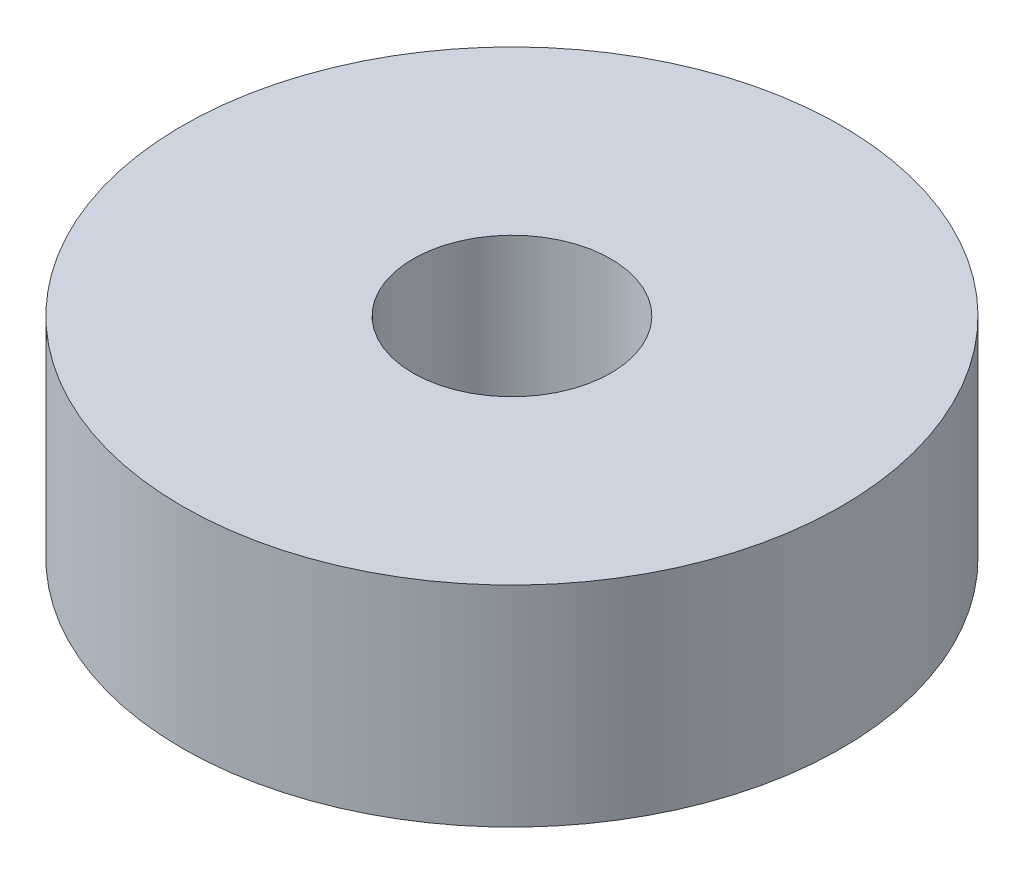
ISO-10303-21;
HEADER;
FILE_DESCRIPTION(('STEP AP214'),'2;1');
FILE_NAME('part.step','',(''),(''),'','','');
FILE_SCHEMA(('AUTOMOTIVE_DESIGN { 1 0 10303 214 1 1 1 1 }'));
ENDSEC;
DATA;
#1=APPLICATION_CONTEXT('core data for automotive mechanical design processes');
#2=APPLICATION_PROTOCOL_DEFINITION('international standard','automotive_design',2000,#1);
#3=PRODUCT_CONTEXT('',#1,'mechanical');
#4=PRODUCT('Part','Part','',(#3));
#5=PRODUCT_RELATED_PRODUCT_CATEGORY('part','',(#4));
#6=PRODUCT_DEFINITION_FORMATION('','',#4);
#7=PRODUCT_DEFINITION_CONTEXT('part definition',#1,'design');
#8=PRODUCT_DEFINITION('design','',#6,#7);
#9=PRODUCT_DEFINITION_SHAPE('','',#8);
#10=(LENGTH_UNIT() NAMED_UNIT(*) SI_UNIT(.MILLI.,.METRE.));
#11=(NAMED_UNIT(*) PLANE_ANGLE_UNIT() SI_UNIT($,.RADIAN.));
#12=(NAMED_UNIT(*) SI_UNIT($,.STERADIAN.) SOLID_ANGLE_UNIT());
#13=UNCERTAINTY_MEASURE_WITH_UNIT(LENGTH_MEASURE(1.E-05),#10,'distance_accuracy_value','');
#14=(GEOMETRIC_REPRESENTATION_CONTEXT(3) GLOBAL_UNCERTAINTY_ASSIGNED_CONTEXT((#13)) GLOBAL_UNIT_ASSIGNED_CONTEXT((#10,
#11,#12)) REPRESENTATION_CONTEXT('',''));
#15=CARTESIAN_POINT('',(0.,0.,0.));
#16=DIRECTION('',(0.,0.,1.));
#17=DIRECTION('',(1.,0.,0.));
#18=AXIS2_PLACEMENT_3D('',#15,#16,#17);
#19=CARTESIAN_POINT('',(1.68370415584828,3.175,-0.967834465551231));
#20=DIRECTION('',(0.,1.,0.));
#21=DIRECTION('',(0.,0.,1.));
#22=AXIS2_PLACEMENT_3D('',#19,#20,#21);
#23=PLANE('',#22);
#24=CARTESIAN_POINT('',(1.68370415584828,3.175,-0.967834465551231));
#25=DIRECTION('',(0.,1.,0.));
#26=DIRECTION('',(0.,0.,1.));
#27=AXIS2_PLACEMENT_3D('',#24,#25,#26);
#28=CIRCLE('',#27,4.9911);
#29=CARTESIAN_POINT('',(1.68370415584828,3.175,4.02326553444877));
#30=VERTEX_POINT('',#29);
#31=EDGE_CURVE('E10',#30,#30,#28,.T.);
#32=ORIENTED_EDGE('',*,*,#31,.T.);
#33=EDGE_LOOP('',(#32));
#34=FACE_BOUND('',#33,.T.);
#35=CARTESIAN_POINT('',(1.68370415584828,3.175,-0.967834465551231));
#36=DIRECTION('',(0.,1.,0.));
#37=DIRECTION('',(0.,0.,1.));
#38=AXIS2_PLACEMENT_3D('',#35,#36,#37);
#39=CIRCLE('',#38,1.4986);
#40=CARTESIAN_POINT('',(1.68370415584828,3.175,0.530765534448769));
#41=VERTEX_POINT('',#40);
#42=EDGE_CURVE('E41',#41,#41,#39,.T.);
#43=ORIENTED_EDGE('',*,*,#42,.F.);
#44=EDGE_LOOP('',(#43));
#45=FACE_BOUND('',#44,.T.);
#46=ADVANCED_FACE('F30',(#34,#45),#23,.T.);
#47=CARTESIAN_POINT('',(1.68370415584828,0.,-0.967834465551231));
#48=DIRECTION('',(0.,1.,0.));
#49=DIRECTION('',(0.,0.,1.));
#50=AXIS2_PLACEMENT_3D('',#47,#48,#49);
#51=PLANE('',#50);
#52=CARTESIAN_POINT('',(1.68370415584828,0.,-0.967834465551231));
#53=DIRECTION('',(0.,1.,0.));
#54=DIRECTION('',(0.,0.,1.));
#55=AXIS2_PLACEMENT_3D('',#52,#53,#54);
#56=CIRCLE('',#55,4.9911);
#57=CARTESIAN_POINT('',(1.68370415584828,0.,4.02326553444877));
#58=VERTEX_POINT('',#57);
#59=EDGE_CURVE('E34',#58,#58,#56,.T.);
#60=ORIENTED_EDGE('',*,*,#59,.F.);
#61=EDGE_LOOP('',(#60));
#62=FACE_BOUND('',#61,.T.);
#63=CARTESIAN_POINT('',(1.68370415584828,0.,-0.967834465551231));
#64=DIRECTION('',(0.,1.,0.));
#65=DIRECTION('',(0.,0.,1.));
#66=AXIS2_PLACEMENT_3D('',#63,#64,#65);
#67=CIRCLE('',#66,1.4986);
#68=CARTESIAN_POINT('',(1.68370415584828,0.,0.530765534448769));
#69=VERTEX_POINT('',#68);
#70=EDGE_CURVE('E43',#69,#69,#67,.T.);
#71=ORIENTED_EDGE('',*,*,#70,.T.);
#72=EDGE_LOOP('',(#71));
#73=FACE_BOUND('',#72,.T.);
#74=ADVANCED_FACE('F53',(#62,#73),#51,.F.);
#75=CARTESIAN_POINT('',(1.68370415584828,3.175,-0.967834465551231));
#76=DIRECTION('',(0.,-1.,0.));
#77=DIRECTION('',(0.,0.,-1.));
#78=AXIS2_PLACEMENT_3D('',#75,#76,#77);
#79=CYLINDRICAL_SURFACE('',#78,4.9911);
#80=ORIENTED_EDGE('',*,*,#31,.F.);
#81=EDGE_LOOP('',(#80));
#82=FACE_BOUND('',#81,.T.);
#83=ORIENTED_EDGE('',*,*,#59,.T.);
#84=EDGE_LOOP('',(#83));
#85=FACE_BOUND('',#84,.T.);
#86=ADVANCED_FACE('F32',(#82,#85),#79,.T.);
#87=CARTESIAN_POINT('',(1.68370415584828,3.175,-0.967834465551231));
#88=DIRECTION('',(0.,-1.,0.));
#89=DIRECTION('',(0.,0.,-1.));
#90=AXIS2_PLACEMENT_3D('',#87,#88,#89);
#91=CYLINDRICAL_SURFACE('',#90,1.4986);
#92=ORIENTED_EDGE('',*,*,#42,.T.);
#93=EDGE_LOOP('',(#92));
#94=FACE_BOUND('',#93,.T.);
#95=ORIENTED_EDGE('',*,*,#70,.F.);
#96=EDGE_LOOP('',(#95));
#97=FACE_BOUND('',#96,.T.);
#98=ADVANCED_FACE('F49',(#94,#97),#91,.F.);
#99=CLOSED_SHELL('',(#46,#74,#86,#98));
#100=MANIFOLD_SOLID_BREP('B2',#99);
#101=ADVANCED_BREP_SHAPE_REPRESENTATION('',(#18,#100),#14);
#102=SHAPE_DEFINITION_REPRESENTATION(#9,#101);
ENDSEC;
END-ISO-10303-21;
